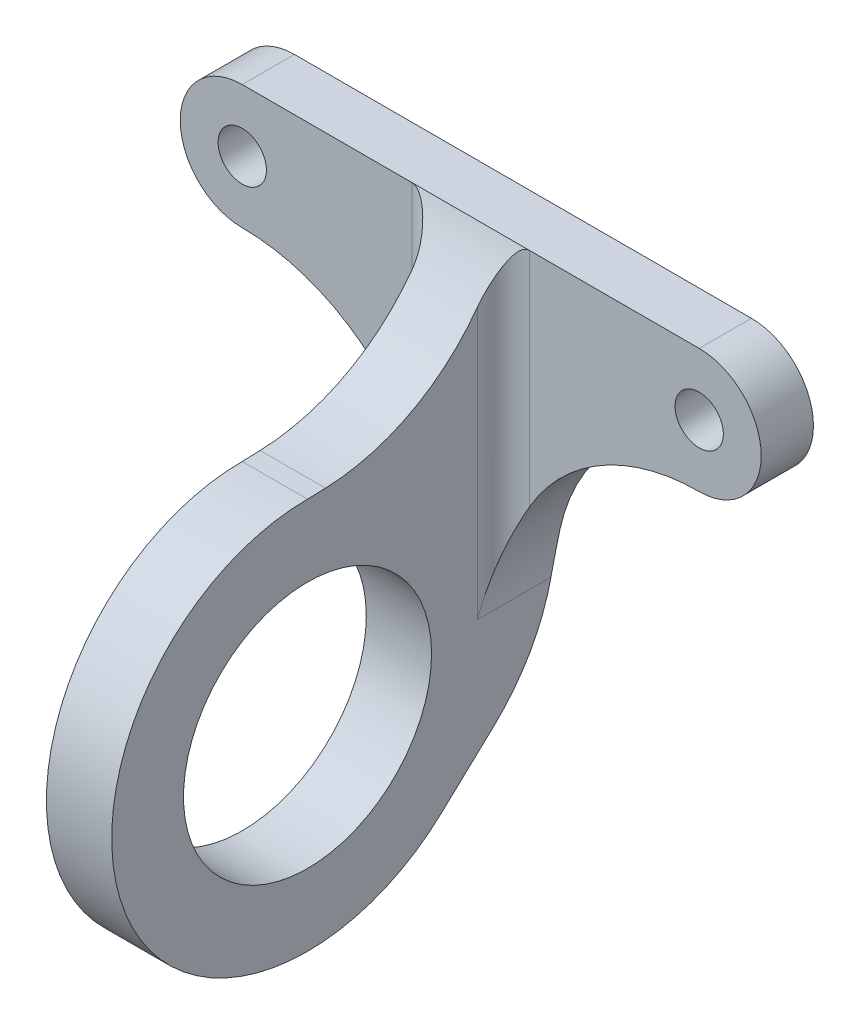
ISO-10303-21;
HEADER;
FILE_DESCRIPTION(('STEP AP214'),'2;1');
FILE_NAME('part.step','',(''),(''),'','','');
FILE_SCHEMA(('AUTOMOTIVE_DESIGN { 1 0 10303 214 1 1 1 1 }'));
ENDSEC;
DATA;
#1=APPLICATION_CONTEXT('core data for automotive mechanical design processes');
#2=APPLICATION_PROTOCOL_DEFINITION('international standard','automotive_design',2000,#1);
#3=PRODUCT_CONTEXT('',#1,'mechanical');
#4=PRODUCT('Part','Part','',(#3));
#5=PRODUCT_RELATED_PRODUCT_CATEGORY('part','',(#4));
#6=PRODUCT_DEFINITION_FORMATION('','',#4);
#7=PRODUCT_DEFINITION_CONTEXT('part definition',#1,'design');
#8=PRODUCT_DEFINITION('design','',#6,#7);
#9=PRODUCT_DEFINITION_SHAPE('','',#8);
#10=(LENGTH_UNIT() NAMED_UNIT(*) SI_UNIT(.MILLI.,.METRE.));
#11=(NAMED_UNIT(*) PLANE_ANGLE_UNIT() SI_UNIT($,.RADIAN.));
#12=(NAMED_UNIT(*) SI_UNIT($,.STERADIAN.) SOLID_ANGLE_UNIT());
#13=UNCERTAINTY_MEASURE_WITH_UNIT(LENGTH_MEASURE(1.E-05),#10,'distance_accuracy_value','');
#14=(GEOMETRIC_REPRESENTATION_CONTEXT(3) GLOBAL_UNCERTAINTY_ASSIGNED_CONTEXT((#13)) GLOBAL_UNIT_ASSIGNED_CONTEXT((#10,
#11,#12)) REPRESENTATION_CONTEXT('',''));
#15=CARTESIAN_POINT('',(0.,0.,0.));
#16=DIRECTION('',(0.,0.,1.));
#17=DIRECTION('',(1.,0.,0.));
#18=AXIS2_PLACEMENT_3D('',#15,#16,#17);
#19=CARTESIAN_POINT('',(-17.5,0.,4.));
#20=DIRECTION('',(0.,0.,1.));
#21=DIRECTION('',(1.,0.,0.));
#22=AXIS2_PLACEMENT_3D('',#19,#20,#21);
#23=PLANE('',#22);
#24=CARTESIAN_POINT('',(-17.5,0.,4.));
#25=DIRECTION('',(0.,0.,1.));
#26=DIRECTION('',(1.,0.,0.));
#27=AXIS2_PLACEMENT_3D('',#24,#25,#26);
#28=CIRCLE('',#27,1.85);
#29=CARTESIAN_POINT('',(-15.65,0.,4.));
#30=VERTEX_POINT('',#29);
#31=EDGE_CURVE('E248',#30,#30,#28,.T.);
#32=ORIENTED_EDGE('',*,*,#31,.F.);
#33=EDGE_LOOP('',(#32));
#34=FACE_BOUND('',#33,.T.);
#35=CARTESIAN_POINT('',(-17.5,-19.75,4.));
#36=DIRECTION('',(0.,0.,1.));
#37=DIRECTION('',(1.,0.,0.));
#38=AXIS2_PLACEMENT_3D('',#35,#36,#37);
#39=CIRCLE('',#38,15.);
#40=CARTESIAN_POINT('',(-17.5,-4.75,4.));
#41=VERTEX_POINT('',#40);
#42=CARTESIAN_POINT('',(-4.5,-12.2666852264521,4.));
#43=VERTEX_POINT('',#42);
#44=EDGE_CURVE('E250',#41,#43,#39,.F.);
#45=ORIENTED_EDGE('',*,*,#44,.T.);
#46=DIRECTION('',(0.,1.,0.));
#47=VECTOR('',#46,1.);
#48=CARTESIAN_POINT('',(-4.5,0.,4.));
#49=LINE('',#48,#47);
#50=CARTESIAN_POINT('',(-4.5,4.75,4.));
#51=VERTEX_POINT('',#50);
#52=EDGE_CURVE('E128',#43,#51,#49,.T.);
#53=ORIENTED_EDGE('',*,*,#52,.T.);
#54=DIRECTION('',(-1.,0.,0.));
#55=VECTOR('',#54,1.);
#56=CARTESIAN_POINT('',(-17.5,4.75,4.));
#57=LINE('',#56,#55);
#58=CARTESIAN_POINT('',(-17.5,4.75,4.));
#59=VERTEX_POINT('',#58);
#60=EDGE_CURVE('E396',#51,#59,#57,.T.);
#61=ORIENTED_EDGE('',*,*,#60,.T.);
#62=CARTESIAN_POINT('',(-17.5,0.,4.));
#63=DIRECTION('',(0.,0.,1.));
#64=DIRECTION('',(1.,0.,0.));
#65=AXIS2_PLACEMENT_3D('',#62,#63,#64);
#66=CIRCLE('',#65,4.75);
#67=EDGE_CURVE('E255',#59,#41,#66,.T.);
#68=ORIENTED_EDGE('',*,*,#67,.T.);
#69=EDGE_LOOP('',(#45,#53,#61,#68));
#70=FACE_BOUND('',#69,.T.);
#71=ADVANCED_FACE('F46',(#34,#70),#23,.T.);
#72=CARTESIAN_POINT('',(17.5,4.75,4.));
#73=VERTEX_POINT('',#72);
#74=CARTESIAN_POINT('',(4.5,4.75,4.));
#75=VERTEX_POINT('',#74);
#76=EDGE_CURVE('E120',#73,#75,#57,.T.);
#77=ORIENTED_EDGE('',*,*,#76,.T.);
#78=DIRECTION('',(0.,-1.,0.));
#79=VECTOR('',#78,1.);
#80=CARTESIAN_POINT('',(4.5,-19.75,4.));
#81=LINE('',#80,#79);
#82=CARTESIAN_POINT('',(4.5,-12.2666852264521,4.));
#83=VERTEX_POINT('',#82);
#84=EDGE_CURVE('E108',#75,#83,#81,.T.);
#85=ORIENTED_EDGE('',*,*,#84,.T.);
#86=CARTESIAN_POINT('',(17.5,-19.75,4.));
#87=DIRECTION('',(0.,0.,1.));
#88=DIRECTION('',(1.,0.,0.));
#89=AXIS2_PLACEMENT_3D('',#86,#87,#88);
#90=CIRCLE('',#89,15.);
#91=CARTESIAN_POINT('',(17.5,-4.75,4.));
#92=VERTEX_POINT('',#91);
#93=EDGE_CURVE('E118',#83,#92,#90,.F.);
#94=ORIENTED_EDGE('',*,*,#93,.T.);
#95=CARTESIAN_POINT('',(17.5,0.,4.));
#96=DIRECTION('',(0.,0.,1.));
#97=DIRECTION('',(1.,0.,0.));
#98=AXIS2_PLACEMENT_3D('',#95,#96,#97);
#99=CIRCLE('',#98,4.75);
#100=EDGE_CURVE('E395',#92,#73,#99,.T.);
#101=ORIENTED_EDGE('',*,*,#100,.T.);
#102=EDGE_LOOP('',(#77,#85,#94,#101));
#103=FACE_BOUND('',#102,.T.);
#104=CARTESIAN_POINT('',(17.5,0.,4.));
#105=DIRECTION('',(0.,0.,1.));
#106=DIRECTION('',(1.,0.,0.));
#107=AXIS2_PLACEMENT_3D('',#104,#105,#106);
#108=CIRCLE('',#107,1.85);
#109=CARTESIAN_POINT('',(19.35,0.,4.));
#110=VERTEX_POINT('',#109);
#111=EDGE_CURVE('E385',#110,#110,#108,.T.);
#112=ORIENTED_EDGE('',*,*,#111,.F.);
#113=EDGE_LOOP('',(#112));
#114=FACE_BOUND('',#113,.T.);
#115=ADVANCED_FACE('F114',(#103,#114),#23,.T.);
#116=CARTESIAN_POINT('',(-17.5,0.,0.));
#117=DIRECTION('',(0.,0.,1.));
#118=DIRECTION('',(1.,0.,0.));
#119=AXIS2_PLACEMENT_3D('',#116,#117,#118);
#120=PLANE('',#119);
#121=CARTESIAN_POINT('',(17.5,0.,0.));
#122=DIRECTION('',(0.,0.,1.));
#123=DIRECTION('',(1.,0.,0.));
#124=AXIS2_PLACEMENT_3D('',#121,#122,#123);
#125=CIRCLE('',#124,4.75);
#126=CARTESIAN_POINT('',(17.5,-4.75,0.));
#127=VERTEX_POINT('',#126);
#128=CARTESIAN_POINT('',(17.5,4.75,0.));
#129=VERTEX_POINT('',#128);
#130=EDGE_CURVE('E318',#127,#129,#125,.T.);
#131=ORIENTED_EDGE('',*,*,#130,.F.);
#132=CARTESIAN_POINT('',(17.5,-19.75,0.));
#133=DIRECTION('',(0.,0.,1.));
#134=DIRECTION('',(1.,0.,0.));
#135=AXIS2_PLACEMENT_3D('',#132,#133,#134);
#136=CIRCLE('',#135,15.);
#137=CARTESIAN_POINT('',(2.85462480689832,-16.5076265709697,0.));
#138=VERTEX_POINT('',#137);
#139=EDGE_CURVE('E134',#127,#138,#136,.T.);
#140=ORIENTED_EDGE('',*,*,#139,.T.);
#141=DIRECTION('',(-1.,0.,0.));
#142=VECTOR('',#141,1.);
#143=CARTESIAN_POINT('',(-17.5,-16.5076265709697,0.));
#144=LINE('',#143,#142);
#145=CARTESIAN_POINT('',(-2.85462480689832,-16.5076265709697,0.));
#146=VERTEX_POINT('',#145);
#147=EDGE_CURVE('E297',#138,#146,#144,.T.);
#148=ORIENTED_EDGE('',*,*,#147,.T.);
#149=CARTESIAN_POINT('',(-17.5,-19.75,0.));
#150=DIRECTION('',(0.,0.,1.));
#151=DIRECTION('',(1.,0.,0.));
#152=AXIS2_PLACEMENT_3D('',#149,#150,#151);
#153=CIRCLE('',#152,15.);
#154=CARTESIAN_POINT('',(-17.5,-4.75,0.));
#155=VERTEX_POINT('',#154);
#156=EDGE_CURVE('E180',#146,#155,#153,.T.);
#157=ORIENTED_EDGE('',*,*,#156,.T.);
#158=CARTESIAN_POINT('',(-17.5,0.,0.));
#159=DIRECTION('',(0.,0.,1.));
#160=DIRECTION('',(1.,0.,0.));
#161=AXIS2_PLACEMENT_3D('',#158,#159,#160);
#162=CIRCLE('',#161,4.75);
#163=CARTESIAN_POINT('',(-17.5,4.75,0.));
#164=VERTEX_POINT('',#163);
#165=EDGE_CURVE('E327',#164,#155,#162,.T.);
#166=ORIENTED_EDGE('',*,*,#165,.F.);
#167=DIRECTION('',(-1.,0.,0.));
#168=VECTOR('',#167,1.);
#169=CARTESIAN_POINT('',(-17.5,4.75,0.));
#170=LINE('',#169,#168);
#171=EDGE_CURVE('E322',#129,#164,#170,.T.);
#172=ORIENTED_EDGE('',*,*,#171,.F.);
#173=EDGE_LOOP('',(#131,#140,#148,#157,#166,#172));
#174=FACE_BOUND('',#173,.T.);
#175=CARTESIAN_POINT('',(17.5,0.,0.));
#176=DIRECTION('',(0.,0.,1.));
#177=DIRECTION('',(1.,0.,0.));
#178=AXIS2_PLACEMENT_3D('',#175,#176,#177);
#179=CIRCLE('',#178,1.85);
#180=CARTESIAN_POINT('',(19.35,0.,0.));
#181=VERTEX_POINT('',#180);
#182=EDGE_CURVE('E384',#181,#181,#179,.T.);
#183=ORIENTED_EDGE('',*,*,#182,.T.);
#184=EDGE_LOOP('',(#183));
#185=FACE_BOUND('',#184,.T.);
#186=CARTESIAN_POINT('',(-17.5,0.,0.));
#187=DIRECTION('',(0.,0.,1.));
#188=DIRECTION('',(1.,0.,0.));
#189=AXIS2_PLACEMENT_3D('',#186,#187,#188);
#190=CIRCLE('',#189,1.85);
#191=CARTESIAN_POINT('',(-15.65,0.,0.));
#192=VERTEX_POINT('',#191);
#193=EDGE_CURVE('E388',#192,#192,#190,.T.);
#194=ORIENTED_EDGE('',*,*,#193,.T.);
#195=EDGE_LOOP('',(#194));
#196=FACE_BOUND('',#195,.T.);
#197=ADVANCED_FACE('F194',(#174,#185,#196),#120,.F.);
#198=CARTESIAN_POINT('',(-17.5,0.,4.));
#199=DIRECTION('',(0.,0.,-1.));
#200=DIRECTION('',(-1.,0.,0.));
#201=AXIS2_PLACEMENT_3D('',#198,#199,#200);
#202=CYLINDRICAL_SURFACE('',#201,4.75);
#203=ORIENTED_EDGE('',*,*,#165,.T.);
#204=DIRECTION('',(0.,0.,-1.));
#205=VECTOR('',#204,1.);
#206=CARTESIAN_POINT('',(-17.5,-4.75,4.));
#207=LINE('',#206,#205);
#208=EDGE_CURVE('E301',#41,#155,#207,.T.);
#209=ORIENTED_EDGE('',*,*,#208,.F.);
#210=ORIENTED_EDGE('',*,*,#67,.F.);
#211=DIRECTION('',(0.,0.,-1.));
#212=VECTOR('',#211,1.);
#213=CARTESIAN_POINT('',(-17.5,4.75,4.));
#214=LINE('',#213,#212);
#215=EDGE_CURVE('E334',#59,#164,#214,.T.);
#216=ORIENTED_EDGE('',*,*,#215,.T.);
#217=EDGE_LOOP('',(#203,#209,#210,#216));
#218=FACE_BOUND('',#217,.T.);
#219=ADVANCED_FACE('F189',(#218),#202,.T.);
#220=CARTESIAN_POINT('',(17.5,0.,4.));
#221=DIRECTION('',(0.,0.,-1.));
#222=DIRECTION('',(-1.,0.,0.));
#223=AXIS2_PLACEMENT_3D('',#220,#221,#222);
#224=CYLINDRICAL_SURFACE('',#223,4.75);
#225=ORIENTED_EDGE('',*,*,#130,.T.);
#226=DIRECTION('',(0.,0.,-1.));
#227=VECTOR('',#226,1.);
#228=CARTESIAN_POINT('',(17.5,4.75,4.));
#229=LINE('',#228,#227);
#230=EDGE_CURVE('E337',#73,#129,#229,.T.);
#231=ORIENTED_EDGE('',*,*,#230,.F.);
#232=ORIENTED_EDGE('',*,*,#100,.F.);
#233=DIRECTION('',(0.,0.,-1.));
#234=VECTOR('',#233,1.);
#235=CARTESIAN_POINT('',(17.5,-4.75,4.));
#236=LINE('',#235,#234);
#237=EDGE_CURVE('E127',#92,#127,#236,.T.);
#238=ORIENTED_EDGE('',*,*,#237,.T.);
#239=EDGE_LOOP('',(#225,#231,#232,#238));
#240=FACE_BOUND('',#239,.T.);
#241=ADVANCED_FACE('F193',(#240),#224,.T.);
#242=CARTESIAN_POINT('',(-17.5,4.75,4.));
#243=DIRECTION('',(0.,-1.,0.));
#244=DIRECTION('',(1.,0.,0.));
#245=AXIS2_PLACEMENT_3D('',#242,#243,#244);
#246=PLANE('',#245);
#247=ORIENTED_EDGE('',*,*,#171,.T.);
#248=ORIENTED_EDGE('',*,*,#215,.F.);
#249=ORIENTED_EDGE('',*,*,#60,.F.);
#250=EDGE_CURVE('E66',#75,#51,#57,.T.);
#251=ORIENTED_EDGE('',*,*,#250,.F.);
#252=ORIENTED_EDGE('',*,*,#76,.F.);
#253=ORIENTED_EDGE('',*,*,#230,.T.);
#254=EDGE_LOOP('',(#247,#248,#249,#251,#252,#253));
#255=FACE_BOUND('',#254,.T.);
#256=ADVANCED_FACE('F198',(#255),#246,.F.);
#257=CARTESIAN_POINT('',(-17.5,0.,4.));
#258=DIRECTION('',(0.,0.,-1.));
#259=DIRECTION('',(-1.,0.,0.));
#260=AXIS2_PLACEMENT_3D('',#257,#258,#259);
#261=CYLINDRICAL_SURFACE('',#260,1.85);
#262=ORIENTED_EDGE('',*,*,#31,.T.);
#263=EDGE_LOOP('',(#262));
#264=FACE_BOUND('',#263,.T.);
#265=ORIENTED_EDGE('',*,*,#193,.F.);
#266=EDGE_LOOP('',(#265));
#267=FACE_BOUND('',#266,.T.);
#268=ADVANCED_FACE('F202',(#264,#267),#261,.F.);
#269=CARTESIAN_POINT('',(17.5,0.,4.));
#270=DIRECTION('',(0.,0.,-1.));
#271=DIRECTION('',(-1.,0.,0.));
#272=AXIS2_PLACEMENT_3D('',#269,#270,#271);
#273=CYLINDRICAL_SURFACE('',#272,1.85);
#274=ORIENTED_EDGE('',*,*,#111,.T.);
#275=EDGE_LOOP('',(#274));
#276=FACE_BOUND('',#275,.T.);
#277=ORIENTED_EDGE('',*,*,#182,.F.);
#278=EDGE_LOOP('',(#277));
#279=FACE_BOUND('',#278,.T.);
#280=ADVANCED_FACE('F210',(#276,#279),#273,.F.);
#281=CARTESIAN_POINT('',(2.5,-20.25,19.));
#282=DIRECTION('',(1.,0.,0.));
#283=DIRECTION('',(0.,0.,-1.));
#284=AXIS2_PLACEMENT_3D('',#281,#282,#283);
#285=PLANE('',#284);
#286=CARTESIAN_POINT('',(2.5,-20.25,19.));
#287=DIRECTION('',(1.,0.,0.));
#288=DIRECTION('',(0.,0.,-1.));
#289=AXIS2_PLACEMENT_3D('',#286,#287,#288);
#290=CIRCLE('',#289,9.5);
#291=CARTESIAN_POINT('',(2.5,-20.25,9.5));
#292=VERTEX_POINT('',#291);
#293=EDGE_CURVE('E378',#292,#292,#290,.T.);
#294=ORIENTED_EDGE('',*,*,#293,.F.);
#295=EDGE_LOOP('',(#294));
#296=FACE_BOUND('',#295,.T.);
#297=DIRECTION('',(0.,0.,-1.));
#298=VECTOR('',#297,1.);
#299=CARTESIAN_POINT('',(2.5,-19.75,19.));
#300=LINE('',#299,#298);
#301=CARTESIAN_POINT('',(2.5,-19.75,0.354624806898317));
#302=VERTEX_POINT('',#301);
#303=CARTESIAN_POINT('',(2.5,-19.75,6.));
#304=VERTEX_POINT('',#303);
#305=EDGE_CURVE('E75',#302,#304,#300,.F.);
#306=ORIENTED_EDGE('',*,*,#305,.T.);
#307=DIRECTION('',(0.,-1.,0.));
#308=VECTOR('',#307,1.);
#309=CARTESIAN_POINT('',(2.5,4.75,6.));
#310=LINE('',#309,#308);
#311=CARTESIAN_POINT('',(2.5,0.961806066865675,6.));
#312=VERTEX_POINT('',#311);
#313=EDGE_CURVE('E109',#304,#312,#310,.F.);
#314=ORIENTED_EDGE('',*,*,#313,.T.);
#315=CARTESIAN_POINT('',(2.5,9.78736874706826,18.1288681820612));
#316=DIRECTION('',(1.,0.,0.));
#317=DIRECTION('',(0.,0.,-1.));
#318=AXIS2_PLACEMENT_3D('',#315,#316,#317);
#319=CIRCLE('',#318,15.);
#320=CARTESIAN_POINT('',(2.5,-5.20430485761905,17.6291457285716));
#321=VERTEX_POINT('',#320);
#322=EDGE_CURVE('E272',#312,#321,#319,.F.);
#323=ORIENTED_EDGE('',*,*,#322,.T.);
#324=DIRECTION('',(0.,-0.0333148302326385,0.999444906979154));
#325=VECTOR('',#324,1.);
#326=CARTESIAN_POINT('',(2.5,-5.25,19.));
#327=LINE('',#326,#325);
#328=CARTESIAN_POINT('',(2.5,-5.25,19.));
#329=VERTEX_POINT('',#328);
#330=EDGE_CURVE('E360',#321,#329,#327,.T.);
#331=ORIENTED_EDGE('',*,*,#330,.T.);
#332=CARTESIAN_POINT('',(2.5,-20.25,19.));
#333=DIRECTION('',(1.,0.,0.));
#334=DIRECTION('',(0.,0.,-1.));
#335=AXIS2_PLACEMENT_3D('',#332,#333,#334);
#336=CIRCLE('',#335,15.);
#337=CARTESIAN_POINT('',(2.5,-31.2034728875861,8.75200352747344));
#338=VERTEX_POINT('',#337);
#339=EDGE_CURVE('E365',#329,#338,#336,.T.);
#340=ORIENTED_EDGE('',*,*,#339,.T.);
#341=DIRECTION('',(0.,0.683199764835104,-0.730231525839072));
#342=VECTOR('',#341,1.);
#343=CARTESIAN_POINT('',(2.5,-23.015156524587,0.));
#344=LINE('',#343,#342);
#345=CARTESIAN_POINT('',(2.5,-27.4610994585558,4.75200352747344));
#346=VERTEX_POINT('',#345);
#347=EDGE_CURVE('E308',#338,#346,#344,.T.);
#348=ORIENTED_EDGE('',*,*,#347,.T.);
#349=CARTESIAN_POINT('',(2.5,-16.5076265709697,15.));
#350=DIRECTION('',(1.,0.,0.));
#351=DIRECTION('',(0.,0.,-1.));
#352=AXIS2_PLACEMENT_3D('',#349,#350,#351);
#353=CIRCLE('',#352,15.);
#354=EDGE_CURVE('E278',#346,#302,#353,.T.);
#355=ORIENTED_EDGE('',*,*,#354,.T.);
#356=EDGE_LOOP('',(#306,#314,#323,#331,#340,#348,#355));
#357=FACE_BOUND('',#356,.T.);
#358=ADVANCED_FACE('F214',(#296,#357),#285,.T.);
#359=CARTESIAN_POINT('',(-2.5,-20.25,19.));
#360=DIRECTION('',(1.,0.,0.));
#361=DIRECTION('',(0.,0.,-1.));
#362=AXIS2_PLACEMENT_3D('',#359,#360,#361);
#363=PLANE('',#362);
#364=CARTESIAN_POINT('',(-2.5,-20.25,19.));
#365=DIRECTION('',(1.,0.,0.));
#366=DIRECTION('',(0.,0.,-1.));
#367=AXIS2_PLACEMENT_3D('',#364,#365,#366);
#368=CIRCLE('',#367,9.5);
#369=CARTESIAN_POINT('',(-2.5,-20.25,9.5));
#370=VERTEX_POINT('',#369);
#371=EDGE_CURVE('E372',#370,#370,#368,.T.);
#372=ORIENTED_EDGE('',*,*,#371,.T.);
#373=EDGE_LOOP('',(#372));
#374=FACE_BOUND('',#373,.T.);
#375=CARTESIAN_POINT('',(-2.5,9.78736874706826,18.1288681820612));
#376=DIRECTION('',(1.,0.,0.));
#377=DIRECTION('',(0.,0.,-1.));
#378=AXIS2_PLACEMENT_3D('',#375,#376,#377);
#379=CIRCLE('',#378,15.);
#380=CARTESIAN_POINT('',(-2.5,-5.20430485761905,17.6291457285716));
#381=VERTEX_POINT('',#380);
#382=CARTESIAN_POINT('',(-2.5,0.961806066865675,6.));
#383=VERTEX_POINT('',#382);
#384=EDGE_CURVE('E264',#381,#383,#379,.T.);
#385=ORIENTED_EDGE('',*,*,#384,.T.);
#386=DIRECTION('',(0.,1.,0.));
#387=VECTOR('',#386,1.);
#388=CARTESIAN_POINT('',(-2.5,-20.25,6.));
#389=LINE('',#388,#387);
#390=CARTESIAN_POINT('',(-2.5,-19.75,6.));
#391=VERTEX_POINT('',#390);
#392=EDGE_CURVE('E121',#383,#391,#389,.F.);
#393=ORIENTED_EDGE('',*,*,#392,.T.);
#394=DIRECTION('',(0.,0.,-1.));
#395=VECTOR('',#394,1.);
#396=CARTESIAN_POINT('',(-2.5,-19.75,0.));
#397=LINE('',#396,#395);
#398=CARTESIAN_POINT('',(-2.5,-19.75,0.354624806898317));
#399=VERTEX_POINT('',#398);
#400=EDGE_CURVE('E276',#391,#399,#397,.T.);
#401=ORIENTED_EDGE('',*,*,#400,.T.);
#402=CARTESIAN_POINT('',(-2.5,-16.5076265709697,15.));
#403=DIRECTION('',(1.,0.,0.));
#404=DIRECTION('',(0.,0.,-1.));
#405=AXIS2_PLACEMENT_3D('',#402,#403,#404);
#406=CIRCLE('',#405,15.);
#407=CARTESIAN_POINT('',(-2.5,-27.4610994585558,4.75200352747344));
#408=VERTEX_POINT('',#407);
#409=EDGE_CURVE('E286',#399,#408,#406,.F.);
#410=ORIENTED_EDGE('',*,*,#409,.T.);
#411=DIRECTION('',(0.,0.683199764835104,-0.730231525839072));
#412=VECTOR('',#411,1.);
#413=CARTESIAN_POINT('',(-2.5,-23.015156524587,0.));
#414=LINE('',#413,#412);
#415=CARTESIAN_POINT('',(-2.5,-31.2034728875861,8.75200352747344));
#416=VERTEX_POINT('',#415);
#417=EDGE_CURVE('E366',#416,#408,#414,.T.);
#418=ORIENTED_EDGE('',*,*,#417,.F.);
#419=CARTESIAN_POINT('',(-2.5,-20.25,19.));
#420=DIRECTION('',(1.,0.,0.));
#421=DIRECTION('',(0.,0.,-1.));
#422=AXIS2_PLACEMENT_3D('',#419,#420,#421);
#423=CIRCLE('',#422,15.);
#424=CARTESIAN_POINT('',(-2.5,-5.25,19.));
#425=VERTEX_POINT('',#424);
#426=EDGE_CURVE('E369',#425,#416,#423,.T.);
#427=ORIENTED_EDGE('',*,*,#426,.F.);
#428=DIRECTION('',(0.,-0.0333148302326385,0.999444906979154));
#429=VECTOR('',#428,1.);
#430=CARTESIAN_POINT('',(-2.5,-5.25,19.));
#431=LINE('',#430,#429);
#432=EDGE_CURVE('E271',#381,#425,#431,.T.);
#433=ORIENTED_EDGE('',*,*,#432,.F.);
#434=EDGE_LOOP('',(#385,#393,#401,#410,#418,#427,#433));
#435=FACE_BOUND('',#434,.T.);
#436=ADVANCED_FACE('F220',(#374,#435),#363,.F.);
#437=CARTESIAN_POINT('',(2.5,-5.25,19.));
#438=DIRECTION('',(0.,-0.999444906979154,-0.0333148302326385));
#439=DIRECTION('',(0.,0.0333148302326385,-0.999444906979154));
#440=AXIS2_PLACEMENT_3D('',#437,#438,#439);
#441=PLANE('',#440);
#442=ORIENTED_EDGE('',*,*,#330,.F.);
#443=DIRECTION('',(1.,0.,0.));
#444=VECTOR('',#443,1.);
#445=CARTESIAN_POINT('',(2.5,-5.20430485761905,17.6291457285716));
#446=LINE('',#445,#444);
#447=EDGE_CURVE('E273',#321,#381,#446,.F.);
#448=ORIENTED_EDGE('',*,*,#447,.T.);
#449=ORIENTED_EDGE('',*,*,#432,.T.);
#450=DIRECTION('',(-1.,0.,0.));
#451=VECTOR('',#450,1.);
#452=CARTESIAN_POINT('',(2.5,-5.25,19.));
#453=LINE('',#452,#451);
#454=EDGE_CURVE('E363',#329,#425,#453,.T.);
#455=ORIENTED_EDGE('',*,*,#454,.F.);
#456=EDGE_LOOP('',(#442,#448,#449,#455));
#457=FACE_BOUND('',#456,.T.);
#458=ADVANCED_FACE('F216',(#457),#441,.F.);
#459=CARTESIAN_POINT('',(2.5,-20.25,19.));
#460=DIRECTION('',(-1.,0.,0.));
#461=DIRECTION('',(0.,0.,1.));
#462=AXIS2_PLACEMENT_3D('',#459,#460,#461);
#463=CYLINDRICAL_SURFACE('',#462,15.);
#464=ORIENTED_EDGE('',*,*,#426,.T.);
#465=DIRECTION('',(-1.,0.,0.));
#466=VECTOR('',#465,1.);
#467=CARTESIAN_POINT('',(2.5,-31.2034728875861,8.75200352747344));
#468=LINE('',#467,#466);
#469=EDGE_CURVE('E376',#338,#416,#468,.T.);
#470=ORIENTED_EDGE('',*,*,#469,.F.);
#471=ORIENTED_EDGE('',*,*,#339,.F.);
#472=ORIENTED_EDGE('',*,*,#454,.T.);
#473=EDGE_LOOP('',(#464,#470,#471,#472));
#474=FACE_BOUND('',#473,.T.);
#475=ADVANCED_FACE('F219',(#474),#463,.T.);
#476=CARTESIAN_POINT('',(2.5,-23.015156524587,0.));
#477=DIRECTION('',(0.,0.730231525839072,0.683199764835104));
#478=DIRECTION('',(0.,-0.683199764835104,0.730231525839072));
#479=AXIS2_PLACEMENT_3D('',#476,#477,#478);
#480=PLANE('',#479);
#481=ORIENTED_EDGE('',*,*,#417,.T.);
#482=DIRECTION('',(-1.,0.,0.));
#483=VECTOR('',#482,1.);
#484=CARTESIAN_POINT('',(2.5,-27.4610994585558,4.75200352747344));
#485=LINE('',#484,#483);
#486=EDGE_CURVE('E296',#408,#346,#485,.F.);
#487=ORIENTED_EDGE('',*,*,#486,.T.);
#488=ORIENTED_EDGE('',*,*,#347,.F.);
#489=ORIENTED_EDGE('',*,*,#469,.T.);
#490=EDGE_LOOP('',(#481,#487,#488,#489));
#491=FACE_BOUND('',#490,.T.);
#492=ADVANCED_FACE('F224',(#491),#480,.F.);
#493=CARTESIAN_POINT('',(2.5,-20.25,19.));
#494=DIRECTION('',(-1.,0.,0.));
#495=DIRECTION('',(0.,0.,1.));
#496=AXIS2_PLACEMENT_3D('',#493,#494,#495);
#497=CYLINDRICAL_SURFACE('',#496,9.5);
#498=ORIENTED_EDGE('',*,*,#293,.T.);
#499=EDGE_LOOP('',(#498));
#500=FACE_BOUND('',#499,.T.);
#501=ORIENTED_EDGE('',*,*,#371,.F.);
#502=EDGE_LOOP('',(#501));
#503=FACE_BOUND('',#502,.T.);
#504=ADVANCED_FACE('F187',(#500,#503),#497,.F.);
#505=CARTESIAN_POINT('',(-17.5,-16.5076265709697,15.));
#506=DIRECTION('',(-1.,0.,0.));
#507=DIRECTION('',(0.,0.,1.));
#508=AXIS2_PLACEMENT_3D('',#505,#506,#507);
#509=CYLINDRICAL_SURFACE('',#508,15.);
#510=ORIENTED_EDGE('',*,*,#354,.F.);
#511=ORIENTED_EDGE('',*,*,#486,.F.);
#512=ORIENTED_EDGE('',*,*,#409,.F.);
#513=CARTESIAN_POINT('',(-2.5,-19.75,0.354624806898315));
#514=CARTESIAN_POINT('',(-2.49996280447386,-19.4812203291305,0.295080184268318));
#515=CARTESIAN_POINT('',(-2.50722446572897,-19.2107741036712,0.243006571458294));
#516=CARTESIAN_POINT('',(-2.53651543600405,-18.6698165138701,0.154147328565789));
#517=CARTESIAN_POINT('',(-2.55845758417566,-18.3993148996775,0.117273530456526));
#518=CARTESIAN_POINT('',(-2.61727353045653,-17.8583116712922,0.0584575841756583));
#519=CARTESIAN_POINT('',(-2.65414732856579,-17.5878100570996,0.0365154360040532));
#520=CARTESIAN_POINT('',(-2.74300657145829,-17.0468524672985,0.00722446572897285));
#521=CARTESIAN_POINT('',(-2.79508018426832,-16.7764062418392,-3.71955261431719E-05));
#522=CARTESIAN_POINT('',(-2.85462480689832,-16.5076265709697,0.));
#523=B_SPLINE_CURVE_WITH_KNOTS('',3,(#513,#514,#515,#516,#517,#518,#519,#520,#521,#522),
.UNSPECIFIED.,.F.,.F.,(4,2,2,2,4),(0.,0.825703988334187,1.64654861160602,2.46739323487785,
3.29309722321203),.UNSPECIFIED.);
#524=EDGE_CURVE('E173',#399,#146,#523,.T.);
#525=ORIENTED_EDGE('',*,*,#524,.T.);
#526=ORIENTED_EDGE('',*,*,#147,.F.);
#527=CARTESIAN_POINT('',(2.85462480689832,-16.5076265709697,0.));
#528=CARTESIAN_POINT('',(2.79508018426832,-16.7764062418392,-3.71955261444873E-05));
#529=CARTESIAN_POINT('',(2.7430065714583,-17.0468524672985,0.00722446572897191));
#530=CARTESIAN_POINT('',(2.65414732856579,-17.5878100570996,0.0365154360040539));
#531=CARTESIAN_POINT('',(2.61727353045653,-17.8583116712922,0.0584575841756603));
#532=CARTESIAN_POINT('',(2.55845758417566,-18.3993148996775,0.117273530456529));
#533=CARTESIAN_POINT('',(2.53651543600406,-18.6698165138701,0.15414732856579));
#534=CARTESIAN_POINT('',(2.50722446572898,-19.2107741036712,0.243006571458294));
#535=CARTESIAN_POINT('',(2.49996280447386,-19.4812203291305,0.295080184268317));
#536=CARTESIAN_POINT('',(2.5,-19.75,0.354624806898316));
#537=B_SPLINE_CURVE_WITH_KNOTS('',3,(#527,#528,#529,#530,#531,#532,#533,#534,#535,#536),
.UNSPECIFIED.,.F.,.F.,(4,2,2,2,4),(0.,0.825703988334187,1.64654861160602,2.46739323487785,
3.29309722321203),.UNSPECIFIED.);
#538=EDGE_CURVE('E129',#138,#302,#537,.T.);
#539=ORIENTED_EDGE('',*,*,#538,.T.);
#540=EDGE_LOOP('',(#510,#511,#512,#525,#526,#539));
#541=FACE_BOUND('',#540,.T.);
#542=ADVANCED_FACE('F183',(#541),#509,.T.);
#543=CARTESIAN_POINT('',(-17.5,9.78736874706826,18.1288681820612));
#544=DIRECTION('',(1.,0.,0.));
#545=DIRECTION('',(0.,1.,0.));
#546=AXIS2_PLACEMENT_3D('',#543,#544,#545);
#547=CYLINDRICAL_SURFACE('',#546,15.);
#548=ORIENTED_EDGE('',*,*,#322,.F.);
#549=CARTESIAN_POINT('',(2.5,0.961806066865675,6.));
#550=CARTESIAN_POINT('',(2.50000508410233,1.0292223883262,5.9509434177074));
#551=CARTESIAN_POINT('',(2.50180426486956,1.09703453584186,5.90246099022033));
#552=CARTESIAN_POINT('',(2.50878158580289,1.23332678895463,5.80672163783449));
#553=CARTESIAN_POINT('',(2.51395900919528,1.301806749824,5.75946445518215));
#554=CARTESIAN_POINT('',(2.53423663597611,1.50800945660924,5.61968114043154));
#555=CARTESIAN_POINT('',(2.5540827927533,1.64659002627332,5.52907415070846));
#556=CARTESIAN_POINT('',(2.60547798501285,1.92667995645397,5.35243236434426));
#557=CARTESIAN_POINT('',(2.63715645561224,2.06820472180434,5.26646064241986));
#558=CARTESIAN_POINT('',(2.71141385643581,2.3518678451951,5.10042538908905));
#559=CARTESIAN_POINT('',(2.75399295947333,2.49400621292811,5.02036195137564));
#560=CARTESIAN_POINT('',(2.83922446865122,2.74654123928659,4.88339431522074));
#561=CARTESIAN_POINT('',(2.87977516399163,2.85700091385036,4.825286130334));
#562=CARTESIAN_POINT('',(2.96756552675006,3.0772330337558,4.71285699222674));
#563=CARTESIAN_POINT('',(3.01480636171582,3.18700535564316,4.65853670253567));
#564=CARTESIAN_POINT('',(3.11627576077002,3.40453538035997,4.55411503817688));
#565=CARTESIAN_POINT('',(3.17046805124922,3.51230043084796,4.5039938511246));
#566=CARTESIAN_POINT('',(3.28709594297002,3.7251656291898,4.407961601925));
#567=CARTESIAN_POINT('',(3.3495244112144,3.83026799024825,4.36204695432474));
#568=CARTESIAN_POINT('',(3.46106862326276,3.99969698916673,4.29022208216726));
#569=CARTESIAN_POINT('',(3.50718638857068,4.06540935389768,4.26293882776162));
#570=CARTESIAN_POINT('',(3.60491535048164,4.19389345270965,4.21061250624013));
#571=CARTESIAN_POINT('',(3.65653854269862,4.25665831793373,4.18557455907507));
#572=CARTESIAN_POINT('',(3.76715670074942,4.37783298477688,4.13811423535279));
#573=CARTESIAN_POINT('',(3.82622366980388,4.43618987556041,4.11572222824231));
#574=CARTESIAN_POINT('',(3.95330201364145,4.5440274922107,4.0750202876619));
#575=CARTESIAN_POINT('',(4.02127553015444,4.59354380148051,4.05669391420035));
#576=CARTESIAN_POINT('',(4.13270691571816,4.65659388729507,4.03363139432216));
#577=CARTESIAN_POINT('',(4.17231699676571,4.67600367175438,4.0265898497996));
#578=CARTESIAN_POINT('',(4.25418666259056,4.70882849341112,4.01473587437519));
#579=CARTESIAN_POINT('',(4.29643539940558,4.72226644184905,4.00991492142063));
#580=CARTESIAN_POINT('',(4.36580148650576,4.73785478638549,4.00433455913448));
#581=CARTESIAN_POINT('',(4.39232784467541,4.74236620144416,4.00272337100994));
#582=CARTESIAN_POINT('',(4.44589135545378,4.74845849000507,4.00054958444784));
#583=CARTESIAN_POINT('',(4.47293042312393,4.75002430089457,3.99999237554896));
#584=CARTESIAN_POINT('',(4.5,4.75,4.));
#585=B_SPLINE_CURVE_WITH_KNOTS('',3,(#549,#550,#551,#552,#553,#554,#555,#556,#557,#558,#559,
#560,#561,#562,#563,#564,#565,#566,#567,#568,#569,#570,#571,#572,#573,#574,#575,#576,#577,#578,
#579,#580,#581,#582,#583,#584),.UNSPECIFIED.,.F.,.F.,(4,2,2,2,2,2,2,2,2,2,2,2,2,2,2,2,2,4),(0.,
0.250074683991863,0.500096325997453,0.999788358574284,1.50511477907943,2.01044921128073,
2.40394690940084,2.79751336465285,3.18910386729708,3.58035742974994,3.83454428743584,
4.08929676092054,4.34673593225623,4.6031143261252,4.73671985871778,4.86980828607597,
4.95050216358489,5.03160756655495),.UNSPECIFIED.);
#586=EDGE_CURVE('E13',#312,#75,#585,.T.);
#587=ORIENTED_EDGE('',*,*,#586,.T.);
#588=ORIENTED_EDGE('',*,*,#250,.T.);
#589=CARTESIAN_POINT('',(-4.5,4.75,4.));
#590=CARTESIAN_POINT('',(-4.47773042475154,4.7500100180061,3.99999686778321));
#591=CARTESIAN_POINT('',(-4.45547616320753,4.74895594219263,4.00037220955516));
#592=CARTESIAN_POINT('',(-4.41121923304764,4.74481427338193,4.00184967089391));
#593=CARTESIAN_POINT('',(-4.38921619909821,4.74173016290977,4.00295054581244));
#594=CARTESIAN_POINT('',(-4.32449335514409,4.72969761758959,4.00725226564709));
#595=CARTESIAN_POINT('',(-4.2823412585028,4.71796242274132,4.01145432927588));
#596=CARTESIAN_POINT('',(-4.18869584966032,4.68409540566474,4.02365627174232));
#597=CARTESIAN_POINT('',(-4.13806236711002,4.65992989091385,4.03240624650654));
#598=CARTESIAN_POINT('',(-4.04118481389534,4.60446744495162,4.0527035835091));
#599=CARTESIAN_POINT('',(-3.99497351661754,4.57312235625682,4.06426987099349));
#600=CARTESIAN_POINT('',(-3.91012571177845,4.50825129562934,4.08849678828676));
#601=CARTESIAN_POINT('',(-3.87118108559935,4.47506465226499,4.10101050971555));
#602=CARTESIAN_POINT('',(-3.79641054616185,4.40582537623507,4.12742642677638));
#603=CARTESIAN_POINT('',(-3.76058753308906,4.36977013670079,4.14132988836008));
#604=CARTESIAN_POINT('',(-3.65704368577462,4.25849566786166,4.18477012215331));
#605=CARTESIAN_POINT('',(-3.59332764022234,4.18023368992006,4.21601235372265));
#606=CARTESIAN_POINT('',(-3.46363309207339,4.00552660294748,4.28759937948134));
#607=CARTESIAN_POINT('',(-3.39914922925012,3.90826876745385,4.32858564400396));
#608=CARTESIAN_POINT('',(-3.27853233299017,3.71031877726432,4.41460041591969));
#609=CARTESIAN_POINT('',(-3.22240884018056,3.60962285771036,4.45963344886855));
#610=CARTESIAN_POINT('',(-3.11703818994261,3.40602125162751,4.55348558457617));
#611=CARTESIAN_POINT('',(-3.06781107957352,3.30311008661108,4.60231510873393));
#612=CARTESIAN_POINT('',(-2.97565906995251,3.09623560101076,4.70344450518687));
#613=CARTESIAN_POINT('',(-2.93273264288159,2.99227254205257,4.75574353170009));
#614=CARTESIAN_POINT('',(-2.83027338903301,2.72521008014804,4.89408376747588));
#615=CARTESIAN_POINT('',(-2.77497644221142,2.56173153847786,4.98256134136428));
#616=CARTESIAN_POINT('',(-2.67852466921673,2.23503990749683,5.16748038145147));
#617=CARTESIAN_POINT('',(-2.63737282106126,2.07182688127565,5.26392351937426));
#618=CARTESIAN_POINT('',(-2.58718608924216,1.82929037428005,5.41360679793626));
#619=CARTESIAN_POINT('',(-2.57244118369322,1.74934815581454,5.46398732968785));
#620=CARTESIAN_POINT('',(-2.54682101289211,1.58999570316539,5.56654162829801));
#621=CARTESIAN_POINT('',(-2.53594542539784,1.51058542522173,5.61871524542894));
#622=CARTESIAN_POINT('',(-2.51829397828888,1.35243328034886,5.72479917359059));
#623=CARTESIAN_POINT('',(-2.51151931915042,1.27369161578927,5.77870998829646));
#624=CARTESIAN_POINT('',(-2.50237658211181,1.1170591095999,5.88816224411914));
#625=CARTESIAN_POINT('',(-2.50000979596953,1.03916852403089,5.94370415839868));
#626=CARTESIAN_POINT('',(-2.49999999999996,0.961806066865686,5.99999999999999));
#627=B_SPLINE_CURVE_WITH_KNOTS('',3,(#589,#590,#591,#592,#593,#594,#595,#596,#597,#598,#599,
#600,#601,#602,#603,#604,#605,#606,#607,#608,#609,#610,#611,#612,#613,#614,#615,#616,#617,#618,
#619,#620,#621,#622,#623,#624,#625,#626),.UNSPECIFIED.,.F.,.F.,(4,2,2,2,2,2,2,2,2,2,2,2,2,2,2,2,
2,2,4),(0.,0.0667533123100183,0.133392406709831,0.264550877454346,0.433950956229186,
0.604522418268345,0.762314750380243,0.920252152865019,1.23644266272521,1.60699874380857,
1.97797450619588,2.3500072216545,2.72194957532383,3.3030483317238,3.88426935407333,
4.17109992971629,4.45790661212109,4.74479721169924,5.0317718733438),.UNSPECIFIED.);
#628=EDGE_CURVE('E146',#51,#383,#627,.T.);
#629=ORIENTED_EDGE('',*,*,#628,.T.);
#630=ORIENTED_EDGE('',*,*,#384,.F.);
#631=ORIENTED_EDGE('',*,*,#447,.F.);
#632=EDGE_LOOP('',(#548,#587,#588,#629,#630,#631));
#633=FACE_BOUND('',#632,.T.);
#634=ADVANCED_FACE('F155',(#633),#547,.F.);
#635=CARTESIAN_POINT('',(-17.5,-19.75,19.));
#636=DIRECTION('',(0.,0.,1.));
#637=DIRECTION('',(1.,0.,0.));
#638=AXIS2_PLACEMENT_3D('',#635,#636,#637);
#639=CYLINDRICAL_SURFACE('',#638,15.);
#640=ORIENTED_EDGE('',*,*,#44,.F.);
#641=ORIENTED_EDGE('',*,*,#208,.T.);
#642=ORIENTED_EDGE('',*,*,#156,.F.);
#643=ORIENTED_EDGE('',*,*,#524,.F.);
#644=ORIENTED_EDGE('',*,*,#400,.F.);
#645=CARTESIAN_POINT('',(-4.5,-12.2666852264521,4.));
#646=CARTESIAN_POINT('',(-4.43751280191482,-12.375231280744,4.00001810034907));
#647=CARTESIAN_POINT('',(-4.37640584633603,-12.4845368565581,4.00292752397919));
#648=CARTESIAN_POINT('',(-4.25707345053475,-12.704397982612,4.01390005180194));
#649=CARTESIAN_POINT('',(-4.19884677491323,-12.8149529715187,4.02196092543701));
#650=CARTESIAN_POINT('',(-4.08546546557292,-13.0368959604718,4.0425859791804));
#651=CARTESIAN_POINT('',(-4.03030441069046,-13.1482816187655,4.05514030243742));
#652=CARTESIAN_POINT('',(-3.9229572158657,-13.3719670985829,4.0842459150096));
#653=CARTESIAN_POINT('',(-3.87077144275403,-13.4842670308876,4.10079769587065));
#654=CARTESIAN_POINT('',(-3.71920917459811,-13.8212348897719,4.15558014552483));
#655=CARTESIAN_POINT('',(-3.62426691384968,-14.0470706566798,4.19904937208384));
#656=CARTESIAN_POINT('',(-3.44622554506712,-14.5010980529507,4.29709551715027));
#657=CARTESIAN_POINT('',(-3.36313556476563,-14.7292913544224,4.35168091880021));
#658=CARTESIAN_POINT('',(-3.15392816881997,-15.3498958349479,4.51147157480582));
#659=CARTESIAN_POINT('',(-3.03909556750806,-15.7439789521666,4.62511883897043));
#660=CARTESIAN_POINT('',(-2.84286531628302,-16.5352317435871,4.86932093266988));
#661=CARTESIAN_POINT('',(-2.76148537685571,-16.9324029396018,4.99988467013208));
#662=CARTESIAN_POINT('',(-2.63130798677737,-17.7288663026517,5.27151465369925));
#663=CARTESIAN_POINT('',(-2.58254259114043,-18.1281601686814,5.41259108127022));
#664=CARTESIAN_POINT('',(-2.51721545350135,-18.9273498735702,5.69965179353589));
#665=CARTESIAN_POINT('',(-2.50063066614705,-19.3272450762583,5.84563248988773));
#666=CARTESIAN_POINT('',(-2.50000588541432,-19.7346607532026,5.99439890012347));
#667=CARTESIAN_POINT('',(-2.50000000327974,-19.7423304061626,5.99719946168296));
#668=CARTESIAN_POINT('',(-2.5,-19.75,6.));
#669=B_SPLINE_CURVE_WITH_KNOTS('',3,(#645,#646,#647,#648,#649,#650,#651,#652,#653,#654,#655,
#656,#657,#658,#659,#660,#661,#662,#663,#664,#665,#666,#667,#668),.UNSPECIFIED.,.F.,.F.,(4,2,2,
2,2,2,2,2,2,2,2,4),(0.,0.375654978141577,0.751147409263758,1.12582115645949,1.50054099875201,
2.24627201503065,2.9925742718253,4.26823934752243,5.5445789178523,6.82217109480787,
8.09884801735055,8.12334292119317),.UNSPECIFIED.);
#670=EDGE_CURVE('E95',#391,#43,#669,.F.);
#671=ORIENTED_EDGE('',*,*,#670,.T.);
#672=EDGE_LOOP('',(#640,#641,#642,#643,#644,#671));
#673=FACE_BOUND('',#672,.T.);
#674=ADVANCED_FACE('F164',(#673),#639,.F.);
#675=CARTESIAN_POINT('',(17.5,-19.75,4.));
#676=DIRECTION('',(0.,0.,-1.));
#677=DIRECTION('',(-1.,0.,0.));
#678=AXIS2_PLACEMENT_3D('',#675,#676,#677);
#679=CYLINDRICAL_SURFACE('',#678,15.);
#680=ORIENTED_EDGE('',*,*,#93,.F.);
#681=CARTESIAN_POINT('',(4.5,-12.2666852264521,4.));
#682=CARTESIAN_POINT('',(4.43751280191493,-12.3752312807438,4.00001810034907));
#683=CARTESIAN_POINT('',(4.37640584633624,-12.4845368565577,4.00292752397918));
#684=CARTESIAN_POINT('',(4.25707345053517,-12.7043979826112,4.01390005180189));
#685=CARTESIAN_POINT('',(4.19884677491375,-12.8149529715177,4.02196092543693));
#686=CARTESIAN_POINT('',(4.08546546557359,-13.0368959604704,4.04258597918026));
#687=CARTESIAN_POINT('',(4.03030441069119,-13.148281618764,4.05514030243725));
#688=CARTESIAN_POINT('',(3.92295721586655,-13.3719670985811,4.08424591500935));
#689=CARTESIAN_POINT('',(3.87077144275494,-13.4842670308856,4.10079769587035));
#690=CARTESIAN_POINT('',(3.71920917459886,-13.8212348897702,4.1555801455245));
#691=CARTESIAN_POINT('',(3.62426691385024,-14.0470706566784,4.19904937208356));
#692=CARTESIAN_POINT('',(3.44622554506737,-14.5010980529501,4.2970955171501));
#693=CARTESIAN_POINT('',(3.36313556476575,-14.729291354422,4.35168091880009));
#694=CARTESIAN_POINT('',(3.15392816881995,-15.349895834948,4.5114715748059));
#695=CARTESIAN_POINT('',(3.03909556750802,-15.7439789521667,4.62511883897078));
#696=CARTESIAN_POINT('',(2.84286531628293,-16.5352317435877,4.8693209326697));
#697=CARTESIAN_POINT('',(2.76148537685559,-16.9324029396028,4.99988467013114));
#698=CARTESIAN_POINT('',(2.63130798677728,-17.728866302652,5.27151465370064));
#699=CARTESIAN_POINT('',(2.58254259114036,-18.1281601686804,5.41259108127472));
#700=CARTESIAN_POINT('',(2.51721545350135,-18.9273498735721,5.69965179353169));
#701=CARTESIAN_POINT('',(2.50063066614709,-19.3272450762643,5.84563248987172));
#702=CARTESIAN_POINT('',(2.50000588541432,-19.7346607532028,5.99439890012285));
#703=CARTESIAN_POINT('',(2.50000000327974,-19.7423304061627,5.99719946168265));
#704=CARTESIAN_POINT('',(2.5,-19.75,6.));
#705=B_SPLINE_CURVE_WITH_KNOTS('',3,(#681,#682,#683,#684,#685,#686,#687,#688,#689,#690,#691,
#692,#693,#694,#695,#696,#697,#698,#699,#700,#701,#702,#703,#704),.UNSPECIFIED.,.F.,.F.,(4,2,2,
2,2,2,2,2,2,2,2,4),(0.,0.375654978140912,0.751147409262427,1.12582115645765,1.50054099874965,
2.24627201502955,2.9925742718253,4.26823934752267,5.54457891785316,6.82217109480837,
8.09884801735053,8.12334292119316),.UNSPECIFIED.);
#706=EDGE_CURVE('E59',#83,#304,#705,.T.);
#707=ORIENTED_EDGE('',*,*,#706,.T.);
#708=ORIENTED_EDGE('',*,*,#305,.F.);
#709=ORIENTED_EDGE('',*,*,#538,.F.);
#710=ORIENTED_EDGE('',*,*,#139,.F.);
#711=ORIENTED_EDGE('',*,*,#237,.F.);
#712=EDGE_LOOP('',(#680,#707,#708,#709,#710,#711));
#713=FACE_BOUND('',#712,.T.);
#714=ADVANCED_FACE('F124',(#713),#679,.F.);
#715=CARTESIAN_POINT('',(-4.5,0.,6.));
#716=DIRECTION('',(0.,1.,0.));
#717=DIRECTION('',(0.,0.,1.));
#718=AXIS2_PLACEMENT_3D('',#715,#716,#717);
#719=CYLINDRICAL_SURFACE('',#718,2.);
#720=ORIENTED_EDGE('',*,*,#670,.F.);
#721=ORIENTED_EDGE('',*,*,#392,.F.);
#722=ORIENTED_EDGE('',*,*,#628,.F.);
#723=ORIENTED_EDGE('',*,*,#52,.F.);
#724=EDGE_LOOP('',(#720,#721,#722,#723));
#725=FACE_BOUND('',#724,.T.);
#726=ADVANCED_FACE('F157',(#725),#719,.F.);
#727=CARTESIAN_POINT('',(4.5,0.,6.));
#728=DIRECTION('',(0.,1.,0.));
#729=DIRECTION('',(0.,0.,1.));
#730=AXIS2_PLACEMENT_3D('',#727,#728,#729);
#731=CYLINDRICAL_SURFACE('',#730,2.);
#732=ORIENTED_EDGE('',*,*,#586,.F.);
#733=ORIENTED_EDGE('',*,*,#313,.F.);
#734=ORIENTED_EDGE('',*,*,#706,.F.);
#735=ORIENTED_EDGE('',*,*,#84,.F.);
#736=EDGE_LOOP('',(#732,#733,#734,#735));
#737=FACE_BOUND('',#736,.T.);
#738=ADVANCED_FACE('F48',(#737),#731,.F.);
#739=CLOSED_SHELL('',(#71,#115,#197,#219,#241,#256,#268,#280,#358,#436,#458,#475,#492,#504,#542,
#634,#674,#714,#726,#738));
#740=MANIFOLD_SOLID_BREP('B2',#739);
#741=ADVANCED_BREP_SHAPE_REPRESENTATION('',(#18,#740),#14);
#742=SHAPE_DEFINITION_REPRESENTATION(#9,#741);
ENDSEC;
END-ISO-10303-21;
